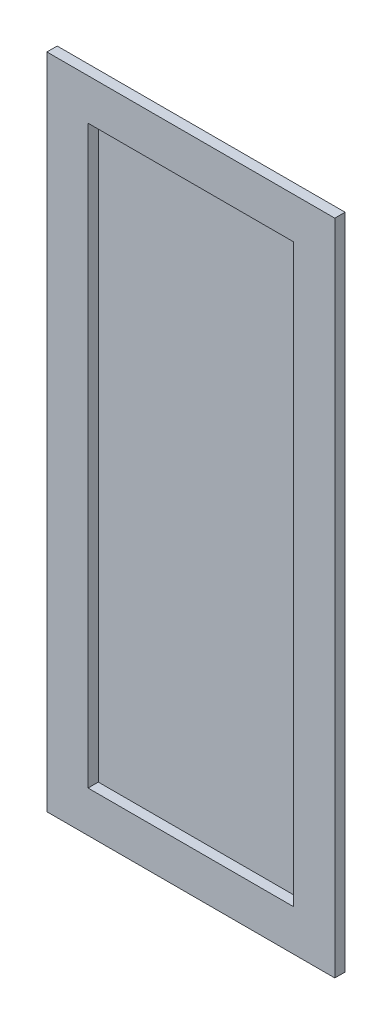
ISO-10303-21;
HEADER;
FILE_DESCRIPTION(('STEP AP214'),'2;1');
FILE_NAME('part.step','',(''),(''),'','','');
FILE_SCHEMA(('AUTOMOTIVE_DESIGN { 1 0 10303 214 1 1 1 1 }'));
ENDSEC;
DATA;
#1=APPLICATION_CONTEXT('core data for automotive mechanical design processes');
#2=APPLICATION_PROTOCOL_DEFINITION('international standard','automotive_design',2000,#1);
#3=PRODUCT_CONTEXT('',#1,'mechanical');
#4=PRODUCT('Part','Part','',(#3));
#5=PRODUCT_RELATED_PRODUCT_CATEGORY('part','',(#4));
#6=PRODUCT_DEFINITION_FORMATION('','',#4);
#7=PRODUCT_DEFINITION_CONTEXT('part definition',#1,'design');
#8=PRODUCT_DEFINITION('design','',#6,#7);
#9=PRODUCT_DEFINITION_SHAPE('','',#8);
#10=(LENGTH_UNIT() NAMED_UNIT(*) SI_UNIT(.MILLI.,.METRE.));
#11=(NAMED_UNIT(*) PLANE_ANGLE_UNIT() SI_UNIT($,.RADIAN.));
#12=(NAMED_UNIT(*) SI_UNIT($,.STERADIAN.) SOLID_ANGLE_UNIT());
#13=UNCERTAINTY_MEASURE_WITH_UNIT(LENGTH_MEASURE(1.E-05),#10,'distance_accuracy_value','');
#14=(GEOMETRIC_REPRESENTATION_CONTEXT(3) GLOBAL_UNCERTAINTY_ASSIGNED_CONTEXT((#13)) GLOBAL_UNIT_ASSIGNED_CONTEXT((#10,
#11,#12)) REPRESENTATION_CONTEXT('',''));
#15=CARTESIAN_POINT('',(0.,0.,0.));
#16=DIRECTION('',(0.,0.,1.));
#17=DIRECTION('',(1.,0.,0.));
#18=AXIS2_PLACEMENT_3D('',#15,#16,#17);
#19=CARTESIAN_POINT('',(60.,-150.,5.));
#20=DIRECTION('',(-1.,0.,0.));
#21=DIRECTION('',(0.,0.,1.));
#22=AXIS2_PLACEMENT_3D('',#19,#20,#21);
#23=PLANE('',#22);
#24=DIRECTION('',(0.,1.,0.));
#25=VECTOR('',#24,1.);
#26=CARTESIAN_POINT('',(60.,-150.,0.));
#27=LINE('',#26,#25);
#28=CARTESIAN_POINT('',(60.,-150.,0.));
#29=VERTEX_POINT('',#28);
#30=CARTESIAN_POINT('',(60.,150.,0.));
#31=VERTEX_POINT('',#30);
#32=EDGE_CURVE('E207',#29,#31,#27,.T.);
#33=ORIENTED_EDGE('',*,*,#32,.T.);
#34=DIRECTION('',(0.,0.,-1.));
#35=VECTOR('',#34,1.);
#36=CARTESIAN_POINT('',(60.,150.,5.));
#37=LINE('',#36,#35);
#38=CARTESIAN_POINT('',(60.,150.,5.));
#39=VERTEX_POINT('',#38);
#40=EDGE_CURVE('E11',#39,#31,#37,.T.);
#41=ORIENTED_EDGE('',*,*,#40,.F.);
#42=DIRECTION('',(0.,1.,0.));
#43=VECTOR('',#42,1.);
#44=CARTESIAN_POINT('',(60.,-150.,5.));
#45=LINE('',#44,#43);
#46=CARTESIAN_POINT('',(60.,-150.,5.));
#47=VERTEX_POINT('',#46);
#48=EDGE_CURVE('E208',#47,#39,#45,.T.);
#49=ORIENTED_EDGE('',*,*,#48,.F.);
#50=DIRECTION('',(0.,0.,-1.));
#51=VECTOR('',#50,1.);
#52=CARTESIAN_POINT('',(60.,-150.,5.));
#53=LINE('',#52,#51);
#54=EDGE_CURVE('E218',#47,#29,#53,.T.);
#55=ORIENTED_EDGE('',*,*,#54,.T.);
#56=EDGE_LOOP('',(#33,#41,#49,#55));
#57=FACE_BOUND('',#56,.T.);
#58=ADVANCED_FACE('F39',(#57),#23,.F.);
#59=CARTESIAN_POINT('',(-60.,150.,5.));
#60=DIRECTION('',(0.,-1.,0.));
#61=DIRECTION('',(1.,0.,0.));
#62=AXIS2_PLACEMENT_3D('',#59,#60,#61);
#63=PLANE('',#62);
#64=DIRECTION('',(-1.,0.,0.));
#65=VECTOR('',#64,1.);
#66=CARTESIAN_POINT('',(-60.,150.,0.));
#67=LINE('',#66,#65);
#68=CARTESIAN_POINT('',(-60.,150.,0.));
#69=VERTEX_POINT('',#68);
#70=EDGE_CURVE('E221',#31,#69,#67,.T.);
#71=ORIENTED_EDGE('',*,*,#70,.T.);
#72=DIRECTION('',(0.,0.,-1.));
#73=VECTOR('',#72,1.);
#74=CARTESIAN_POINT('',(-60.,150.,5.));
#75=LINE('',#74,#73);
#76=CARTESIAN_POINT('',(-60.,150.,5.));
#77=VERTEX_POINT('',#76);
#78=EDGE_CURVE('E46',#77,#69,#75,.T.);
#79=ORIENTED_EDGE('',*,*,#78,.F.);
#80=DIRECTION('',(-1.,0.,0.));
#81=VECTOR('',#80,1.);
#82=CARTESIAN_POINT('',(-60.,150.,5.));
#83=LINE('',#82,#81);
#84=EDGE_CURVE('E87',#39,#77,#83,.T.);
#85=ORIENTED_EDGE('',*,*,#84,.F.);
#86=ORIENTED_EDGE('',*,*,#40,.T.);
#87=EDGE_LOOP('',(#71,#79,#85,#86));
#88=FACE_BOUND('',#87,.T.);
#89=ADVANCED_FACE('F252',(#88),#63,.F.);
#90=CARTESIAN_POINT('',(-60.,-150.,5.));
#91=DIRECTION('',(1.,0.,0.));
#92=DIRECTION('',(0.,0.,-1.));
#93=AXIS2_PLACEMENT_3D('',#90,#91,#92);
#94=PLANE('',#93);
#95=DIRECTION('',(0.,-1.,0.));
#96=VECTOR('',#95,1.);
#97=CARTESIAN_POINT('',(-60.,-150.,0.));
#98=LINE('',#97,#96);
#99=CARTESIAN_POINT('',(-60.,-150.,0.));
#100=VERTEX_POINT('',#99);
#101=EDGE_CURVE('E223',#69,#100,#98,.T.);
#102=ORIENTED_EDGE('',*,*,#101,.T.);
#103=DIRECTION('',(0.,0.,-1.));
#104=VECTOR('',#103,1.);
#105=CARTESIAN_POINT('',(-60.,-150.,5.));
#106=LINE('',#105,#104);
#107=CARTESIAN_POINT('',(-60.,-150.,5.));
#108=VERTEX_POINT('',#107);
#109=EDGE_CURVE('E62',#108,#100,#106,.T.);
#110=ORIENTED_EDGE('',*,*,#109,.F.);
#111=DIRECTION('',(0.,-1.,0.));
#112=VECTOR('',#111,1.);
#113=CARTESIAN_POINT('',(-60.,-150.,5.));
#114=LINE('',#113,#112);
#115=EDGE_CURVE('E212',#77,#108,#114,.T.);
#116=ORIENTED_EDGE('',*,*,#115,.F.);
#117=ORIENTED_EDGE('',*,*,#78,.T.);
#118=EDGE_LOOP('',(#102,#110,#116,#117));
#119=FACE_BOUND('',#118,.T.);
#120=ADVANCED_FACE('F229',(#119),#94,.F.);
#121=CARTESIAN_POINT('',(-60.,-150.,5.));
#122=DIRECTION('',(0.,1.,0.));
#123=DIRECTION('',(-1.,0.,0.));
#124=AXIS2_PLACEMENT_3D('',#121,#122,#123);
#125=PLANE('',#124);
#126=DIRECTION('',(1.,0.,0.));
#127=VECTOR('',#126,1.);
#128=CARTESIAN_POINT('',(-60.,-150.,0.));
#129=LINE('',#128,#127);
#130=EDGE_CURVE('E82',#100,#29,#129,.T.);
#131=ORIENTED_EDGE('',*,*,#130,.T.);
#132=ORIENTED_EDGE('',*,*,#54,.F.);
#133=DIRECTION('',(1.,0.,0.));
#134=VECTOR('',#133,1.);
#135=CARTESIAN_POINT('',(-60.,-150.,5.));
#136=LINE('',#135,#134);
#137=EDGE_CURVE('E215',#108,#47,#136,.T.);
#138=ORIENTED_EDGE('',*,*,#137,.F.);
#139=ORIENTED_EDGE('',*,*,#109,.T.);
#140=EDGE_LOOP('',(#131,#132,#138,#139));
#141=FACE_BOUND('',#140,.T.);
#142=ADVANCED_FACE('F234',(#141),#125,.F.);
#143=CARTESIAN_POINT('',(0.,0.,0.));
#144=DIRECTION('',(0.,0.,-1.));
#145=DIRECTION('',(-1.,0.,0.));
#146=AXIS2_PLACEMENT_3D('',#143,#144,#145);
#147=PLANE('',#146);
#148=ORIENTED_EDGE('',*,*,#32,.F.);
#149=ORIENTED_EDGE('',*,*,#130,.F.);
#150=ORIENTED_EDGE('',*,*,#101,.F.);
#151=ORIENTED_EDGE('',*,*,#70,.F.);
#152=EDGE_LOOP('',(#148,#149,#150,#151));
#153=FACE_BOUND('',#152,.T.);
#154=ADVANCED_FACE('F232',(#153),#147,.T.);
#155=CARTESIAN_POINT('',(0.,0.,5.));
#156=DIRECTION('',(0.,0.,1.));
#157=DIRECTION('',(1.,0.,0.));
#158=AXIS2_PLACEMENT_3D('',#155,#156,#157);
#159=PLANE('',#158);
#160=DIRECTION('',(1.,0.,0.));
#161=VECTOR('',#160,1.);
#162=CARTESIAN_POINT('',(-70.,-160.,5.));
#163=LINE('',#162,#161);
#164=CARTESIAN_POINT('',(-70.,-160.,5.));
#165=VERTEX_POINT('',#164);
#166=CARTESIAN_POINT('',(70.,-160.,5.));
#167=VERTEX_POINT('',#166);
#168=EDGE_CURVE('E154',#165,#167,#163,.T.);
#169=ORIENTED_EDGE('',*,*,#168,.F.);
#170=DIRECTION('',(0.,-1.,0.));
#171=VECTOR('',#170,1.);
#172=CARTESIAN_POINT('',(-70.,160.,5.));
#173=LINE('',#172,#171);
#174=CARTESIAN_POINT('',(-70.,160.,5.));
#175=VERTEX_POINT('',#174);
#176=EDGE_CURVE('E182',#175,#165,#173,.T.);
#177=ORIENTED_EDGE('',*,*,#176,.F.);
#178=DIRECTION('',(-1.,0.,0.));
#179=VECTOR('',#178,1.);
#180=CARTESIAN_POINT('',(70.,160.,5.));
#181=LINE('',#180,#179);
#182=CARTESIAN_POINT('',(70.,160.,5.));
#183=VERTEX_POINT('',#182);
#184=EDGE_CURVE('E193',#183,#175,#181,.T.);
#185=ORIENTED_EDGE('',*,*,#184,.F.);
#186=DIRECTION('',(0.,1.,0.));
#187=VECTOR('',#186,1.);
#188=CARTESIAN_POINT('',(70.,-160.,5.));
#189=LINE('',#188,#187);
#190=EDGE_CURVE('E191',#167,#183,#189,.T.);
#191=ORIENTED_EDGE('',*,*,#190,.F.);
#192=EDGE_LOOP('',(#169,#177,#185,#191));
#193=FACE_BOUND('',#192,.T.);
#194=ORIENTED_EDGE('',*,*,#137,.T.);
#195=ORIENTED_EDGE('',*,*,#48,.T.);
#196=ORIENTED_EDGE('',*,*,#84,.T.);
#197=ORIENTED_EDGE('',*,*,#115,.T.);
#198=EDGE_LOOP('',(#194,#195,#196,#197));
#199=FACE_BOUND('',#198,.T.);
#200=ADVANCED_FACE('F236',(#193,#199),#159,.F.);
#201=CARTESIAN_POINT('',(0.,0.,10.));
#202=DIRECTION('',(0.,0.,1.));
#203=DIRECTION('',(1.,0.,0.));
#204=AXIS2_PLACEMENT_3D('',#201,#202,#203);
#205=PLANE('',#204);
#206=DIRECTION('',(1.,0.,0.));
#207=VECTOR('',#206,1.);
#208=CARTESIAN_POINT('',(-70.,-160.,10.));
#209=LINE('',#208,#207);
#210=CARTESIAN_POINT('',(-70.,-160.,10.));
#211=VERTEX_POINT('',#210);
#212=CARTESIAN_POINT('',(70.,-160.,10.));
#213=VERTEX_POINT('',#212);
#214=EDGE_CURVE('E178',#211,#213,#209,.T.);
#215=ORIENTED_EDGE('',*,*,#214,.T.);
#216=DIRECTION('',(0.,1.,0.));
#217=VECTOR('',#216,1.);
#218=CARTESIAN_POINT('',(70.,-160.,10.));
#219=LINE('',#218,#217);
#220=CARTESIAN_POINT('',(70.,160.,10.));
#221=VERTEX_POINT('',#220);
#222=EDGE_CURVE('E181',#213,#221,#219,.T.);
#223=ORIENTED_EDGE('',*,*,#222,.T.);
#224=DIRECTION('',(-1.,0.,0.));
#225=VECTOR('',#224,1.);
#226=CARTESIAN_POINT('',(70.,160.,10.));
#227=LINE('',#226,#225);
#228=CARTESIAN_POINT('',(-70.,160.,10.));
#229=VERTEX_POINT('',#228);
#230=EDGE_CURVE('E184',#221,#229,#227,.T.);
#231=ORIENTED_EDGE('',*,*,#230,.T.);
#232=DIRECTION('',(0.,-1.,0.));
#233=VECTOR('',#232,1.);
#234=CARTESIAN_POINT('',(-70.,160.,10.));
#235=LINE('',#234,#233);
#236=EDGE_CURVE('E186',#229,#211,#235,.T.);
#237=ORIENTED_EDGE('',*,*,#236,.T.);
#238=EDGE_LOOP('',(#215,#223,#231,#237));
#239=FACE_BOUND('',#238,.T.);
#240=DIRECTION('',(0.,1.,0.));
#241=VECTOR('',#240,1.);
#242=CARTESIAN_POINT('',(50.,-140.,10.));
#243=LINE('',#242,#241);
#244=CARTESIAN_POINT('',(50.,-140.,10.));
#245=VERTEX_POINT('',#244);
#246=CARTESIAN_POINT('',(50.,140.,10.));
#247=VERTEX_POINT('',#246);
#248=EDGE_CURVE('E146',#245,#247,#243,.T.);
#249=ORIENTED_EDGE('',*,*,#248,.F.);
#250=DIRECTION('',(1.,0.,0.));
#251=VECTOR('',#250,1.);
#252=CARTESIAN_POINT('',(-50.,-140.,10.));
#253=LINE('',#252,#251);
#254=CARTESIAN_POINT('',(-50.,-140.,10.));
#255=VERTEX_POINT('',#254);
#256=EDGE_CURVE('E138',#255,#245,#253,.T.);
#257=ORIENTED_EDGE('',*,*,#256,.F.);
#258=DIRECTION('',(0.,-1.,0.));
#259=VECTOR('',#258,1.);
#260=CARTESIAN_POINT('',(-50.,140.,10.));
#261=LINE('',#260,#259);
#262=CARTESIAN_POINT('',(-50.,140.,10.));
#263=VERTEX_POINT('',#262);
#264=EDGE_CURVE('E162',#263,#255,#261,.T.);
#265=ORIENTED_EDGE('',*,*,#264,.F.);
#266=DIRECTION('',(-1.,0.,0.));
#267=VECTOR('',#266,1.);
#268=CARTESIAN_POINT('',(50.,140.,10.));
#269=LINE('',#268,#267);
#270=EDGE_CURVE('E160',#247,#263,#269,.T.);
#271=ORIENTED_EDGE('',*,*,#270,.F.);
#272=EDGE_LOOP('',(#249,#257,#265,#271));
#273=FACE_BOUND('',#272,.T.);
#274=ADVANCED_FACE('F158',(#239,#273),#205,.T.);
#275=CARTESIAN_POINT('',(-70.,-160.,10.));
#276=DIRECTION('',(0.,1.,0.));
#277=DIRECTION('',(-1.,0.,0.));
#278=AXIS2_PLACEMENT_3D('',#275,#276,#277);
#279=PLANE('',#278);
#280=ORIENTED_EDGE('',*,*,#168,.T.);
#281=DIRECTION('',(0.,0.,-1.));
#282=VECTOR('',#281,1.);
#283=CARTESIAN_POINT('',(70.,-160.,10.));
#284=LINE('',#283,#282);
#285=EDGE_CURVE('E204',#213,#167,#284,.T.);
#286=ORIENTED_EDGE('',*,*,#285,.F.);
#287=ORIENTED_EDGE('',*,*,#214,.F.);
#288=DIRECTION('',(0.,0.,-1.));
#289=VECTOR('',#288,1.);
#290=CARTESIAN_POINT('',(-70.,-160.,10.));
#291=LINE('',#290,#289);
#292=EDGE_CURVE('E188',#211,#165,#291,.T.);
#293=ORIENTED_EDGE('',*,*,#292,.T.);
#294=EDGE_LOOP('',(#280,#286,#287,#293));
#295=FACE_BOUND('',#294,.T.);
#296=ADVANCED_FACE('F244',(#295),#279,.F.);
#297=CARTESIAN_POINT('',(70.,-160.,10.));
#298=DIRECTION('',(-1.,0.,0.));
#299=DIRECTION('',(0.,0.,1.));
#300=AXIS2_PLACEMENT_3D('',#297,#298,#299);
#301=PLANE('',#300);
#302=ORIENTED_EDGE('',*,*,#190,.T.);
#303=DIRECTION('',(0.,0.,-1.));
#304=VECTOR('',#303,1.);
#305=CARTESIAN_POINT('',(70.,160.,10.));
#306=LINE('',#305,#304);
#307=EDGE_CURVE('E201',#221,#183,#306,.T.);
#308=ORIENTED_EDGE('',*,*,#307,.F.);
#309=ORIENTED_EDGE('',*,*,#222,.F.);
#310=ORIENTED_EDGE('',*,*,#285,.T.);
#311=EDGE_LOOP('',(#302,#308,#309,#310));
#312=FACE_BOUND('',#311,.T.);
#313=ADVANCED_FACE('F269',(#312),#301,.F.);
#314=CARTESIAN_POINT('',(70.,160.,10.));
#315=DIRECTION('',(0.,-1.,0.));
#316=DIRECTION('',(1.,0.,0.));
#317=AXIS2_PLACEMENT_3D('',#314,#315,#316);
#318=PLANE('',#317);
#319=ORIENTED_EDGE('',*,*,#184,.T.);
#320=DIRECTION('',(0.,0.,-1.));
#321=VECTOR('',#320,1.);
#322=CARTESIAN_POINT('',(-70.,160.,10.));
#323=LINE('',#322,#321);
#324=EDGE_CURVE('E198',#229,#175,#323,.T.);
#325=ORIENTED_EDGE('',*,*,#324,.F.);
#326=ORIENTED_EDGE('',*,*,#230,.F.);
#327=ORIENTED_EDGE('',*,*,#307,.T.);
#328=EDGE_LOOP('',(#319,#325,#326,#327));
#329=FACE_BOUND('',#328,.T.);
#330=ADVANCED_FACE('F273',(#329),#318,.F.);
#331=CARTESIAN_POINT('',(-70.,160.,10.));
#332=DIRECTION('',(1.,0.,0.));
#333=DIRECTION('',(0.,0.,-1.));
#334=AXIS2_PLACEMENT_3D('',#331,#332,#333);
#335=PLANE('',#334);
#336=ORIENTED_EDGE('',*,*,#176,.T.);
#337=ORIENTED_EDGE('',*,*,#292,.F.);
#338=ORIENTED_EDGE('',*,*,#236,.F.);
#339=ORIENTED_EDGE('',*,*,#324,.T.);
#340=EDGE_LOOP('',(#336,#337,#338,#339));
#341=FACE_BOUND('',#340,.T.);
#342=ADVANCED_FACE('F276',(#341),#335,.F.);
#343=CARTESIAN_POINT('',(-50.,-140.,10.));
#344=DIRECTION('',(0.,1.,0.));
#345=DIRECTION('',(-1.,0.,0.));
#346=AXIS2_PLACEMENT_3D('',#343,#344,#345);
#347=PLANE('',#346);
#348=DIRECTION('',(1.,0.,0.));
#349=VECTOR('',#348,1.);
#350=CARTESIAN_POINT('',(-50.,-140.,5.));
#351=LINE('',#350,#349);
#352=CARTESIAN_POINT('',(-50.,-140.,5.));
#353=VERTEX_POINT('',#352);
#354=CARTESIAN_POINT('',(50.,-140.,5.));
#355=VERTEX_POINT('',#354);
#356=EDGE_CURVE('E166',#353,#355,#351,.T.);
#357=ORIENTED_EDGE('',*,*,#356,.F.);
#358=DIRECTION('',(0.,0.,-1.));
#359=VECTOR('',#358,1.);
#360=CARTESIAN_POINT('',(-50.,-140.,10.));
#361=LINE('',#360,#359);
#362=EDGE_CURVE('E53',#255,#353,#361,.T.);
#363=ORIENTED_EDGE('',*,*,#362,.F.);
#364=ORIENTED_EDGE('',*,*,#256,.T.);
#365=DIRECTION('',(0.,0.,-1.));
#366=VECTOR('',#365,1.);
#367=CARTESIAN_POINT('',(50.,-140.,10.));
#368=LINE('',#367,#366);
#369=EDGE_CURVE('E141',#245,#355,#368,.T.);
#370=ORIENTED_EDGE('',*,*,#369,.T.);
#371=EDGE_LOOP('',(#357,#363,#364,#370));
#372=FACE_BOUND('',#371,.T.);
#373=ADVANCED_FACE('F140',(#372),#347,.T.);
#374=CARTESIAN_POINT('',(50.,-140.,10.));
#375=DIRECTION('',(-1.,0.,0.));
#376=DIRECTION('',(0.,0.,1.));
#377=AXIS2_PLACEMENT_3D('',#374,#375,#376);
#378=PLANE('',#377);
#379=DIRECTION('',(0.,1.,0.));
#380=VECTOR('',#379,1.);
#381=CARTESIAN_POINT('',(50.,-140.,5.));
#382=LINE('',#381,#380);
#383=CARTESIAN_POINT('',(50.,140.,5.));
#384=VERTEX_POINT('',#383);
#385=EDGE_CURVE('E153',#355,#384,#382,.T.);
#386=ORIENTED_EDGE('',*,*,#385,.F.);
#387=ORIENTED_EDGE('',*,*,#369,.F.);
#388=ORIENTED_EDGE('',*,*,#248,.T.);
#389=DIRECTION('',(0.,0.,-1.));
#390=VECTOR('',#389,1.);
#391=CARTESIAN_POINT('',(50.,140.,10.));
#392=LINE('',#391,#390);
#393=EDGE_CURVE('E155',#247,#384,#392,.T.);
#394=ORIENTED_EDGE('',*,*,#393,.T.);
#395=EDGE_LOOP('',(#386,#387,#388,#394));
#396=FACE_BOUND('',#395,.T.);
#397=ADVANCED_FACE('F150',(#396),#378,.T.);
#398=CARTESIAN_POINT('',(50.,140.,10.));
#399=DIRECTION('',(0.,-1.,0.));
#400=DIRECTION('',(1.,0.,0.));
#401=AXIS2_PLACEMENT_3D('',#398,#399,#400);
#402=PLANE('',#401);
#403=DIRECTION('',(-1.,0.,0.));
#404=VECTOR('',#403,1.);
#405=CARTESIAN_POINT('',(50.,140.,5.));
#406=LINE('',#405,#404);
#407=CARTESIAN_POINT('',(-50.,140.,5.));
#408=VERTEX_POINT('',#407);
#409=EDGE_CURVE('E169',#384,#408,#406,.T.);
#410=ORIENTED_EDGE('',*,*,#409,.F.);
#411=ORIENTED_EDGE('',*,*,#393,.F.);
#412=ORIENTED_EDGE('',*,*,#270,.T.);
#413=DIRECTION('',(0.,0.,-1.));
#414=VECTOR('',#413,1.);
#415=CARTESIAN_POINT('',(-50.,140.,10.));
#416=LINE('',#415,#414);
#417=EDGE_CURVE('E175',#263,#408,#416,.T.);
#418=ORIENTED_EDGE('',*,*,#417,.T.);
#419=EDGE_LOOP('',(#410,#411,#412,#418));
#420=FACE_BOUND('',#419,.T.);
#421=ADVANCED_FACE('F296',(#420),#402,.T.);
#422=CARTESIAN_POINT('',(-50.,140.,10.));
#423=DIRECTION('',(1.,0.,0.));
#424=DIRECTION('',(0.,0.,-1.));
#425=AXIS2_PLACEMENT_3D('',#422,#423,#424);
#426=PLANE('',#425);
#427=DIRECTION('',(0.,-1.,0.));
#428=VECTOR('',#427,1.);
#429=CARTESIAN_POINT('',(-50.,140.,5.));
#430=LINE('',#429,#428);
#431=EDGE_CURVE('E147',#408,#353,#430,.T.);
#432=ORIENTED_EDGE('',*,*,#431,.F.);
#433=ORIENTED_EDGE('',*,*,#417,.F.);
#434=ORIENTED_EDGE('',*,*,#264,.T.);
#435=ORIENTED_EDGE('',*,*,#362,.T.);
#436=EDGE_LOOP('',(#432,#433,#434,#435));
#437=FACE_BOUND('',#436,.T.);
#438=ADVANCED_FACE('F265',(#437),#426,.T.);
#439=CARTESIAN_POINT('',(0.,0.,5.));
#440=DIRECTION('',(0.,0.,-1.));
#441=DIRECTION('',(-1.,0.,0.));
#442=AXIS2_PLACEMENT_3D('',#439,#440,#441);
#443=PLANE('',#442);
#444=ORIENTED_EDGE('',*,*,#431,.T.);
#445=ORIENTED_EDGE('',*,*,#356,.T.);
#446=ORIENTED_EDGE('',*,*,#385,.T.);
#447=ORIENTED_EDGE('',*,*,#409,.T.);
#448=EDGE_LOOP('',(#444,#445,#446,#447));
#449=FACE_BOUND('',#448,.T.);
#450=ADVANCED_FACE('F262',(#449),#443,.F.);
#451=CLOSED_SHELL('',(#58,#89,#120,#142,#154,#200,#274,#296,#313,#330,#342,#373,#397,#421,#438,#450));
#452=MANIFOLD_SOLID_BREP('B2',#451);
#453=ADVANCED_BREP_SHAPE_REPRESENTATION('',(#18,#452),#14);
#454=SHAPE_DEFINITION_REPRESENTATION(#9,#453);
ENDSEC;
END-ISO-10303-21;
